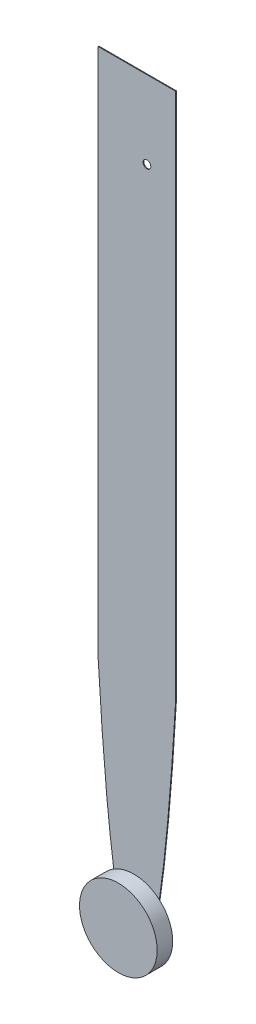
ISO-10303-21;
HEADER;
FILE_DESCRIPTION(('STEP AP214'),'2;1');
FILE_NAME('part.step','',(''),(''),'','','');
FILE_SCHEMA(('AUTOMOTIVE_DESIGN { 1 0 10303 214 1 1 1 1 }'));
ENDSEC;
DATA;
#1=APPLICATION_CONTEXT('core data for automotive mechanical design processes');
#2=APPLICATION_PROTOCOL_DEFINITION('international standard','automotive_design',2000,#1);
#3=PRODUCT_CONTEXT('',#1,'mechanical');
#4=PRODUCT('Part','Part','',(#3));
#5=PRODUCT_RELATED_PRODUCT_CATEGORY('part','',(#4));
#6=PRODUCT_DEFINITION_FORMATION('','',#4);
#7=PRODUCT_DEFINITION_CONTEXT('part definition',#1,'design');
#8=PRODUCT_DEFINITION('design','',#6,#7);
#9=PRODUCT_DEFINITION_SHAPE('','',#8);
#10=(LENGTH_UNIT() NAMED_UNIT(*) SI_UNIT(.MILLI.,.METRE.));
#11=(NAMED_UNIT(*) PLANE_ANGLE_UNIT() SI_UNIT($,.RADIAN.));
#12=(NAMED_UNIT(*) SI_UNIT($,.STERADIAN.) SOLID_ANGLE_UNIT());
#13=UNCERTAINTY_MEASURE_WITH_UNIT(LENGTH_MEASURE(1.E-05),#10,'distance_accuracy_value','');
#14=(GEOMETRIC_REPRESENTATION_CONTEXT(3) GLOBAL_UNCERTAINTY_ASSIGNED_CONTEXT((#13)) GLOBAL_UNIT_ASSIGNED_CONTEXT((#10,
#11,#12)) REPRESENTATION_CONTEXT('',''));
#15=CARTESIAN_POINT('',(0.,0.,0.));
#16=DIRECTION('',(0.,0.,1.));
#17=DIRECTION('',(1.,0.,0.));
#18=AXIS2_PLACEMENT_3D('',#15,#16,#17);
#19=CARTESIAN_POINT('',(3.2412353598919,-22.8284141701089,0.1));
#20=DIRECTION('',(0.,0.,1.));
#21=DIRECTION('',(1.,0.,0.));
#22=AXIS2_PLACEMENT_3D('',#19,#20,#21);
#23=PLANE('',#22);
#24=CARTESIAN_POINT('',(1.68200160279754,58.6748354422751,0.1));
#25=DIRECTION('',(0.,0.,1.));
#26=DIRECTION('',(1.,0.,0.));
#27=AXIS2_PLACEMENT_3D('',#24,#25,#26);
#28=CIRCLE('',#27,0.5);
#29=CARTESIAN_POINT('',(2.18200160279754,58.6748354422751,0.1));
#30=VERTEX_POINT('',#29);
#31=EDGE_CURVE('E219',#30,#30,#28,.T.);
#32=ORIENTED_EDGE('',*,*,#31,.F.);
#33=EDGE_LOOP('',(#32));
#34=FACE_BOUND('',#33,.T.);
#35=CARTESIAN_POINT('',(0.,-26.3251645577249,0.1));
#36=DIRECTION('',(0.,0.,1.));
#37=DIRECTION('',(1.,0.,0.));
#38=AXIS2_PLACEMENT_3D('',#35,#36,#37);
#39=CIRCLE('',#38,5.);
#40=CARTESIAN_POINT('',(3.28274527538361,-22.5537479197828,0.1));
#41=VERTEX_POINT('',#40);
#42=CARTESIAN_POINT('',(-2.59281821919854,-22.0499693946719,0.1));
#43=VERTEX_POINT('',#42);
#44=EDGE_CURVE('E50',#41,#43,#39,.T.);
#45=ORIENTED_EDGE('',*,*,#44,.F.);
#46=CARTESIAN_POINT('',(0.382001602797534,-31.3251645577249,0.1));
#47=CARTESIAN_POINT('',(2.51156504618396,-31.2552425789301,0.1));
#48=CARTESIAN_POINT('',(4.21039484499608,-19.4220143251354,0.1));
#49=CARTESIAN_POINT('',(5.38200160279754,0.729621909049745,0.1));
#50=B_SPLINE_CURVE_WITH_KNOTS('',3,(#46,#47,#48,#49),.UNSPECIFIED.,.F.,.F.,(4,4),(0.,1.),.UNSPECIFIED.);
#51=CARTESIAN_POINT('',(5.38200160279754,0.729621909049745,0.1));
#52=VERTEX_POINT('',#51);
#53=EDGE_CURVE('E108',#41,#52,#50,.T.);
#54=ORIENTED_EDGE('',*,*,#53,.T.);
#55=DIRECTION('',(0.,1.,0.));
#56=VECTOR('',#55,1.);
#57=CARTESIAN_POINT('',(5.38200160279754,68.6748354422751,0.1));
#58=LINE('',#57,#56);
#59=CARTESIAN_POINT('',(5.38200160279754,68.6748354422751,0.1));
#60=VERTEX_POINT('',#59);
#61=EDGE_CURVE('E106',#52,#60,#58,.T.);
#62=ORIENTED_EDGE('',*,*,#61,.T.);
#63=DIRECTION('',(-1.,0.,0.));
#64=VECTOR('',#63,1.);
#65=CARTESIAN_POINT('',(-4.61799839720247,68.6748354422751,0.1));
#66=LINE('',#65,#64);
#67=CARTESIAN_POINT('',(-4.61799839720247,68.6748354422751,0.1));
#68=VERTEX_POINT('',#67);
#69=EDGE_CURVE('E135',#60,#68,#66,.T.);
#70=ORIENTED_EDGE('',*,*,#69,.T.);
#71=DIRECTION('',(0.,-1.,0.));
#72=VECTOR('',#71,1.);
#73=CARTESIAN_POINT('',(-4.61799839720247,68.6748354422751,0.1));
#74=LINE('',#73,#72);
#75=CARTESIAN_POINT('',(-4.61799839720247,0.729621909049745,0.1));
#76=VERTEX_POINT('',#75);
#77=EDGE_CURVE('E137',#68,#76,#74,.T.);
#78=ORIENTED_EDGE('',*,*,#77,.T.);
#79=CARTESIAN_POINT('',(-4.61799839720247,0.729621909049745,0.1));
#80=CARTESIAN_POINT('',(-3.44639163940101,-19.4220143251354,0.1));
#81=CARTESIAN_POINT('',(-1.74756184058889,-31.2552425789301,0.1));
#82=CARTESIAN_POINT('',(0.382001602797534,-31.3251645577249,0.1));
#83=B_SPLINE_CURVE_WITH_KNOTS('',3,(#79,#80,#81,#82),.UNSPECIFIED.,.F.,.F.,(4,4),(0.,1.),.UNSPECIFIED.);
#84=EDGE_CURVE('E139',#76,#43,#83,.T.);
#85=ORIENTED_EDGE('',*,*,#84,.T.);
#86=EDGE_LOOP('',(#45,#54,#62,#70,#78,#85));
#87=FACE_BOUND('',#86,.T.);
#88=ADVANCED_FACE('F38',(#34,#87),#23,.T.);
#89=DIRECTION('',(0.,0.,-1.));
#90=VECTOR('',#89,1.);
#91=SURFACE_OF_LINEAR_EXTRUSION('',#50,#90);
#92=CARTESIAN_POINT('',(0.382001602797534,-31.3251645577249,0.));
#93=CARTESIAN_POINT('',(2.51156504618396,-31.2552425789301,0.));
#94=CARTESIAN_POINT('',(4.21039484499608,-19.4220143251354,0.));
#95=CARTESIAN_POINT('',(5.38200160279754,0.729621909049745,0.));
#96=B_SPLINE_CURVE_WITH_KNOTS('',3,(#92,#93,#94,#95),.UNSPECIFIED.,.F.,.F.,(4,4),(0.,1.),.UNSPECIFIED.);
#97=CARTESIAN_POINT('',(0.382001602797534,-31.3251645577249,0.));
#98=VERTEX_POINT('',#97);
#99=CARTESIAN_POINT('',(5.38200160279754,0.729621909049745,0.));
#100=VERTEX_POINT('',#99);
#101=EDGE_CURVE('E145',#98,#100,#96,.T.);
#102=ORIENTED_EDGE('',*,*,#101,.T.);
#103=DIRECTION('',(0.,0.,-1.));
#104=VECTOR('',#103,1.);
#105=CARTESIAN_POINT('',(5.38200160279754,0.729621909049745,0.1));
#106=LINE('',#105,#104);
#107=EDGE_CURVE('E48',#52,#100,#106,.T.);
#108=ORIENTED_EDGE('',*,*,#107,.F.);
#109=ORIENTED_EDGE('',*,*,#53,.F.);
#110=CARTESIAN_POINT('',(0.550891217050925,-31.2947237803297,0.1));
#111=VERTEX_POINT('',#110);
#112=EDGE_CURVE('E107',#111,#41,#50,.T.);
#113=ORIENTED_EDGE('',*,*,#112,.F.);
#114=CARTESIAN_POINT('',(0.382001602797534,-31.3251645577249,0.1));
#115=VERTEX_POINT('',#114);
#116=EDGE_CURVE('E99',#115,#111,#50,.T.);
#117=ORIENTED_EDGE('',*,*,#116,.F.);
#118=DIRECTION('',(0.,0.,-1.));
#119=VECTOR('',#118,1.);
#120=CARTESIAN_POINT('',(0.382001602797534,-31.3251645577249,0.1));
#121=LINE('',#120,#119);
#122=EDGE_CURVE('E144',#115,#98,#121,.T.);
#123=ORIENTED_EDGE('',*,*,#122,.T.);
#124=EDGE_LOOP('',(#102,#108,#109,#113,#117,#123));
#125=FACE_BOUND('',#124,.T.);
#126=ADVANCED_FACE('F40',(#125),#91,.F.);
#127=CARTESIAN_POINT('',(5.38200160279754,68.6748354422751,0.1));
#128=DIRECTION('',(-1.,0.,0.));
#129=DIRECTION('',(0.,-1.,0.));
#130=AXIS2_PLACEMENT_3D('',#127,#128,#129);
#131=PLANE('',#130);
#132=DIRECTION('',(0.,1.,0.));
#133=VECTOR('',#132,1.);
#134=CARTESIAN_POINT('',(5.38200160279754,68.6748354422751,0.));
#135=LINE('',#134,#133);
#136=CARTESIAN_POINT('',(5.38200160279754,68.6748354422751,0.));
#137=VERTEX_POINT('',#136);
#138=EDGE_CURVE('E197',#100,#137,#135,.T.);
#139=ORIENTED_EDGE('',*,*,#138,.T.);
#140=DIRECTION('',(0.,0.,-1.));
#141=VECTOR('',#140,1.);
#142=CARTESIAN_POINT('',(5.38200160279754,68.6748354422751,0.1));
#143=LINE('',#142,#141);
#144=EDGE_CURVE('E307',#60,#137,#143,.T.);
#145=ORIENTED_EDGE('',*,*,#144,.F.);
#146=ORIENTED_EDGE('',*,*,#61,.F.);
#147=ORIENTED_EDGE('',*,*,#107,.T.);
#148=EDGE_LOOP('',(#139,#145,#146,#147));
#149=FACE_BOUND('',#148,.T.);
#150=ADVANCED_FACE('F165',(#149),#131,.F.);
#151=CARTESIAN_POINT('',(-4.61799839720247,68.6748354422751,0.1));
#152=DIRECTION('',(0.,-1.,0.));
#153=DIRECTION('',(0.,0.,-1.));
#154=AXIS2_PLACEMENT_3D('',#151,#152,#153);
#155=PLANE('',#154);
#156=DIRECTION('',(-1.,0.,0.));
#157=VECTOR('',#156,1.);
#158=CARTESIAN_POINT('',(-4.61799839720247,68.6748354422751,0.));
#159=LINE('',#158,#157);
#160=CARTESIAN_POINT('',(-4.61799839720247,68.6748354422751,0.));
#161=VERTEX_POINT('',#160);
#162=EDGE_CURVE('E199',#137,#161,#159,.T.);
#163=ORIENTED_EDGE('',*,*,#162,.T.);
#164=DIRECTION('',(0.,0.,-1.));
#165=VECTOR('',#164,1.);
#166=CARTESIAN_POINT('',(-4.61799839720247,68.6748354422751,0.1));
#167=LINE('',#166,#165);
#168=EDGE_CURVE('E304',#68,#161,#167,.T.);
#169=ORIENTED_EDGE('',*,*,#168,.F.);
#170=ORIENTED_EDGE('',*,*,#69,.F.);
#171=ORIENTED_EDGE('',*,*,#144,.T.);
#172=EDGE_LOOP('',(#163,#169,#170,#171));
#173=FACE_BOUND('',#172,.T.);
#174=ADVANCED_FACE('F162',(#173),#155,.F.);
#175=CARTESIAN_POINT('',(-4.61799839720247,68.6748354422751,0.1));
#176=DIRECTION('',(1.,0.,0.));
#177=DIRECTION('',(0.,1.,0.));
#178=AXIS2_PLACEMENT_3D('',#175,#176,#177);
#179=PLANE('',#178);
#180=DIRECTION('',(0.,-1.,0.));
#181=VECTOR('',#180,1.);
#182=CARTESIAN_POINT('',(-4.61799839720247,68.6748354422751,0.));
#183=LINE('',#182,#181);
#184=CARTESIAN_POINT('',(-4.61799839720247,0.729621909049745,0.));
#185=VERTEX_POINT('',#184);
#186=EDGE_CURVE('E290',#161,#185,#183,.T.);
#187=ORIENTED_EDGE('',*,*,#186,.T.);
#188=DIRECTION('',(0.,0.,-1.));
#189=VECTOR('',#188,1.);
#190=CARTESIAN_POINT('',(-4.61799839720247,0.729621909049745,0.1));
#191=LINE('',#190,#189);
#192=EDGE_CURVE('E301',#76,#185,#191,.T.);
#193=ORIENTED_EDGE('',*,*,#192,.F.);
#194=ORIENTED_EDGE('',*,*,#77,.F.);
#195=ORIENTED_EDGE('',*,*,#168,.T.);
#196=EDGE_LOOP('',(#187,#193,#194,#195));
#197=FACE_BOUND('',#196,.T.);
#198=ADVANCED_FACE('F157',(#197),#179,.F.);
#199=DIRECTION('',(0.,0.,-1.));
#200=VECTOR('',#199,1.);
#201=SURFACE_OF_LINEAR_EXTRUSION('',#83,#200);
#202=CARTESIAN_POINT('',(-4.61799839720247,0.729621909049745,0.));
#203=CARTESIAN_POINT('',(-3.44639163940101,-19.4220143251354,0.));
#204=CARTESIAN_POINT('',(-1.74756184058889,-31.2552425789301,0.));
#205=CARTESIAN_POINT('',(0.382001602797534,-31.3251645577249,0.));
#206=B_SPLINE_CURVE_WITH_KNOTS('',3,(#202,#203,#204,#205),.UNSPECIFIED.,.F.,.F.,(4,4),(0.,1.),.UNSPECIFIED.);
#207=EDGE_CURVE('E195',#185,#98,#206,.T.);
#208=ORIENTED_EDGE('',*,*,#207,.T.);
#209=ORIENTED_EDGE('',*,*,#122,.F.);
#210=CARTESIAN_POINT('',(0.298012594181272,-31.316275505571,0.1));
#211=VERTEX_POINT('',#210);
#212=EDGE_CURVE('E102',#211,#115,#83,.T.);
#213=ORIENTED_EDGE('',*,*,#212,.F.);
#214=EDGE_CURVE('E63',#43,#211,#83,.T.);
#215=ORIENTED_EDGE('',*,*,#214,.F.);
#216=ORIENTED_EDGE('',*,*,#84,.F.);
#217=ORIENTED_EDGE('',*,*,#192,.T.);
#218=EDGE_LOOP('',(#208,#209,#213,#215,#216,#217));
#219=FACE_BOUND('',#218,.T.);
#220=ADVANCED_FACE('F153',(#219),#201,.F.);
#221=EDGE_CURVE('E11',#211,#111,#39,.T.);
#222=ORIENTED_EDGE('',*,*,#221,.F.);
#223=ORIENTED_EDGE('',*,*,#212,.T.);
#224=ORIENTED_EDGE('',*,*,#116,.T.);
#225=EDGE_LOOP('',(#222,#223,#224));
#226=FACE_BOUND('',#225,.T.);
#227=ADVANCED_FACE('F101',(#226),#23,.T.);
#228=CARTESIAN_POINT('',(3.2412353598919,-22.8284141701089,0.));
#229=DIRECTION('',(0.,0.,1.));
#230=DIRECTION('',(1.,0.,0.));
#231=AXIS2_PLACEMENT_3D('',#228,#229,#230);
#232=PLANE('',#231);
#233=CARTESIAN_POINT('',(1.68200160279754,58.6748354422751,0.));
#234=DIRECTION('',(0.,0.,1.));
#235=DIRECTION('',(1.,0.,0.));
#236=AXIS2_PLACEMENT_3D('',#233,#234,#235);
#237=CIRCLE('',#236,0.5);
#238=CARTESIAN_POINT('',(2.18200160279754,58.6748354422751,0.));
#239=VERTEX_POINT('',#238);
#240=EDGE_CURVE('E43',#239,#239,#237,.T.);
#241=ORIENTED_EDGE('',*,*,#240,.T.);
#242=EDGE_LOOP('',(#241));
#243=FACE_BOUND('',#242,.T.);
#244=ORIENTED_EDGE('',*,*,#101,.F.);
#245=ORIENTED_EDGE('',*,*,#207,.F.);
#246=ORIENTED_EDGE('',*,*,#186,.F.);
#247=ORIENTED_EDGE('',*,*,#162,.F.);
#248=ORIENTED_EDGE('',*,*,#138,.F.);
#249=EDGE_LOOP('',(#244,#245,#246,#247,#248));
#250=FACE_BOUND('',#249,.T.);
#251=ADVANCED_FACE('F158',(#243,#250),#232,.F.);
#252=CARTESIAN_POINT('',(0.,-26.3251645577249,0.1));
#253=DIRECTION('',(0.,0.,1.));
#254=DIRECTION('',(1.,0.,0.));
#255=AXIS2_PLACEMENT_3D('',#252,#253,#254);
#256=PLANE('',#255);
#257=EDGE_CURVE('E116',#111,#41,#39,.T.);
#258=ORIENTED_EDGE('',*,*,#257,.F.);
#259=ORIENTED_EDGE('',*,*,#112,.T.);
#260=EDGE_LOOP('',(#258,#259));
#261=FACE_BOUND('',#260,.T.);
#262=ADVANCED_FACE('F117',(#261),#256,.F.);
#263=EDGE_CURVE('E51',#43,#211,#39,.T.);
#264=ORIENTED_EDGE('',*,*,#263,.F.);
#265=ORIENTED_EDGE('',*,*,#214,.T.);
#266=EDGE_LOOP('',(#264,#265));
#267=FACE_BOUND('',#266,.T.);
#268=ADVANCED_FACE('F187',(#267),#256,.F.);
#269=CARTESIAN_POINT('',(0.,-26.3251645577249,2.1));
#270=DIRECTION('',(0.,0.,-1.));
#271=DIRECTION('',(-1.,0.,0.));
#272=AXIS2_PLACEMENT_3D('',#269,#270,#271);
#273=CYLINDRICAL_SURFACE('',#272,5.);
#274=CARTESIAN_POINT('',(0.,-26.3251645577249,2.1));
#275=DIRECTION('',(0.,0.,1.));
#276=DIRECTION('',(1.,0.,0.));
#277=AXIS2_PLACEMENT_3D('',#274,#275,#276);
#278=CIRCLE('',#277,5.);
#279=CARTESIAN_POINT('',(5.,-26.3251645577249,2.1));
#280=VERTEX_POINT('',#279);
#281=EDGE_CURVE('E124',#280,#280,#278,.T.);
#282=ORIENTED_EDGE('',*,*,#281,.F.);
#283=EDGE_LOOP('',(#282));
#284=FACE_BOUND('',#283,.T.);
#285=ORIENTED_EDGE('',*,*,#44,.T.);
#286=ORIENTED_EDGE('',*,*,#263,.T.);
#287=ORIENTED_EDGE('',*,*,#221,.T.);
#288=ORIENTED_EDGE('',*,*,#257,.T.);
#289=EDGE_LOOP('',(#285,#286,#287,#288));
#290=FACE_BOUND('',#289,.T.);
#291=ADVANCED_FACE('F121',(#284,#290),#273,.T.);
#292=CARTESIAN_POINT('',(0.,-26.3251645577249,2.1));
#293=DIRECTION('',(0.,0.,1.));
#294=DIRECTION('',(1.,0.,0.));
#295=AXIS2_PLACEMENT_3D('',#292,#293,#294);
#296=PLANE('',#295);
#297=ORIENTED_EDGE('',*,*,#281,.T.);
#298=EDGE_LOOP('',(#297));
#299=FACE_BOUND('',#298,.T.);
#300=ADVANCED_FACE('F203',(#299),#296,.T.);
#301=CARTESIAN_POINT('',(1.68200160279754,58.6748354422751,-9.9));
#302=DIRECTION('',(0.,0.,1.));
#303=DIRECTION('',(1.,0.,0.));
#304=AXIS2_PLACEMENT_3D('',#301,#302,#303);
#305=CYLINDRICAL_SURFACE('',#304,0.5);
#306=ORIENTED_EDGE('',*,*,#31,.T.);
#307=EDGE_LOOP('',(#306));
#308=FACE_BOUND('',#307,.T.);
#309=ORIENTED_EDGE('',*,*,#240,.F.);
#310=EDGE_LOOP('',(#309));
#311=FACE_BOUND('',#310,.T.);
#312=ADVANCED_FACE('F210',(#308,#311),#305,.F.);
#313=CLOSED_SHELL('',(#88,#126,#150,#174,#198,#220,#227,#251,#262,#268,#291,#300,#312));
#314=MANIFOLD_SOLID_BREP('B2',#313);
#315=ADVANCED_BREP_SHAPE_REPRESENTATION('',(#18,#314),#14);
#316=SHAPE_DEFINITION_REPRESENTATION(#9,#315);
ENDSEC;
END-ISO-10303-21;
